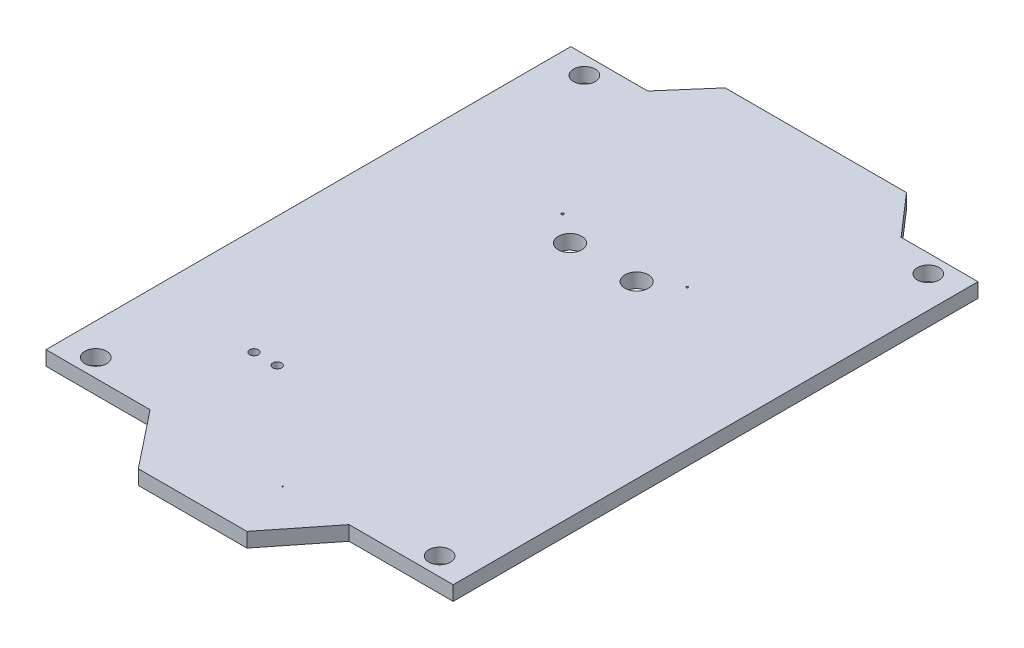
ISO-10303-21;
HEADER;
FILE_DESCRIPTION(('STEP AP214'),'2;1');
FILE_NAME('part.step','',(''),(''),'','','');
FILE_SCHEMA(('AUTOMOTIVE_DESIGN { 1 0 10303 214 1 1 1 1 }'));
ENDSEC;
DATA;
#1=APPLICATION_CONTEXT('core data for automotive mechanical design processes');
#2=APPLICATION_PROTOCOL_DEFINITION('international standard','automotive_design',2000,#1);
#3=PRODUCT_CONTEXT('',#1,'mechanical');
#4=PRODUCT('Part','Part','',(#3));
#5=PRODUCT_RELATED_PRODUCT_CATEGORY('part','',(#4));
#6=PRODUCT_DEFINITION_FORMATION('','',#4);
#7=PRODUCT_DEFINITION_CONTEXT('part definition',#1,'design');
#8=PRODUCT_DEFINITION('design','',#6,#7);
#9=PRODUCT_DEFINITION_SHAPE('','',#8);
#10=(LENGTH_UNIT() NAMED_UNIT(*) SI_UNIT(.MILLI.,.METRE.));
#11=(NAMED_UNIT(*) PLANE_ANGLE_UNIT() SI_UNIT($,.RADIAN.));
#12=(NAMED_UNIT(*) SI_UNIT($,.STERADIAN.) SOLID_ANGLE_UNIT());
#13=UNCERTAINTY_MEASURE_WITH_UNIT(LENGTH_MEASURE(1.E-05),#10,'distance_accuracy_value','');
#14=(GEOMETRIC_REPRESENTATION_CONTEXT(3) GLOBAL_UNCERTAINTY_ASSIGNED_CONTEXT((#13)) GLOBAL_UNIT_ASSIGNED_CONTEXT((#10,
#11,#12)) REPRESENTATION_CONTEXT('',''));
#15=CARTESIAN_POINT('',(0.,0.,0.));
#16=DIRECTION('',(0.,0.,1.));
#17=DIRECTION('',(1.,0.,0.));
#18=AXIS2_PLACEMENT_3D('',#15,#16,#17);
#19=CARTESIAN_POINT('',(-0.0309185608602787,4.07949258906316,0.0488366244301609));
#20=DIRECTION('',(0.,1.,0.));
#21=DIRECTION('',(0.,0.,1.));
#22=AXIS2_PLACEMENT_3D('',#19,#20,#21);
#23=PLANE('',#22);
#24=CARTESIAN_POINT('',(-10.7846583023091,4.07949258906316,17.8089060338347));
#25=DIRECTION('',(0.,-1.,0.));
#26=DIRECTION('',(1.,0.,0.));
#27=AXIS2_PLACEMENT_3D('',#24,#25,#26);
#28=CIRCLE('',#27,0.482599999999997);
#29=CARTESIAN_POINT('',(-10.3020583023091,4.07949258906316,17.8089060338347));
#30=VERTEX_POINT('',#29);
#31=EDGE_CURVE('E286',#30,#30,#28,.T.);
#32=ORIENTED_EDGE('',*,*,#31,.T.);
#33=EDGE_LOOP('',(#32));
#34=FACE_BOUND('',#33,.T.);
#35=CARTESIAN_POINT('',(-8.24481401918051,4.07949258906316,17.780781001229));
#36=DIRECTION('',(0.,-1.,0.));
#37=DIRECTION('',(1.,0.,0.));
#38=AXIS2_PLACEMENT_3D('',#35,#36,#37);
#39=CIRCLE('',#38,0.4826);
#40=CARTESIAN_POINT('',(-7.76221401918051,4.07949258906316,17.780781001229));
#41=VERTEX_POINT('',#40);
#42=EDGE_CURVE('E290',#41,#41,#39,.T.);
#43=ORIENTED_EDGE('',*,*,#42,.T.);
#44=EDGE_LOOP('',(#43));
#45=FACE_BOUND('',#44,.T.);
#46=CARTESIAN_POINT('',(3.63345968758914,4.07949258906316,29.0658349324321));
#47=DIRECTION('',(0.,-1.,0.));
#48=DIRECTION('',(1.,0.,0.));
#49=AXIS2_PLACEMENT_3D('',#46,#47,#48);
#50=CIRCLE('',#49,0.0585206197350784);
#51=CARTESIAN_POINT('',(3.69198030732421,4.07949258906316,29.0658349324321));
#52=VERTEX_POINT('',#51);
#53=EDGE_CURVE('E294',#52,#52,#50,.T.);
#54=ORIENTED_EDGE('',*,*,#53,.T.);
#55=EDGE_LOOP('',(#54));
#56=FACE_BOUND('',#55,.T.);
#57=CARTESIAN_POINT('',(3.59032109320918,4.07949258906316,-10.104860026321));
#58=DIRECTION('',(0.,-1.,0.));
#59=DIRECTION('',(1.,0.,0.));
#60=AXIS2_PLACEMENT_3D('',#57,#58,#59);
#61=CIRCLE('',#60,1.2954);
#62=CARTESIAN_POINT('',(4.88572109320918,4.07949258906316,-10.104860026321));
#63=VERTEX_POINT('',#62);
#64=EDGE_CURVE('E298',#63,#63,#61,.T.);
#65=ORIENTED_EDGE('',*,*,#64,.T.);
#66=EDGE_LOOP('',(#65));
#67=FACE_BOUND('',#66,.T.);
#68=CARTESIAN_POINT('',(-3.77567890679082,4.07949258906316,-10.104860026321));
#69=DIRECTION('',(0.,-1.,0.));
#70=DIRECTION('',(1.,0.,0.));
#71=AXIS2_PLACEMENT_3D('',#68,#69,#70);
#72=CIRCLE('',#71,1.2954);
#73=CARTESIAN_POINT('',(-2.48027890679082,4.07949258906316,-10.104860026321));
#74=VERTEX_POINT('',#73);
#75=EDGE_CURVE('E302',#74,#74,#72,.T.);
#76=ORIENTED_EDGE('',*,*,#75,.T.);
#77=EDGE_LOOP('',(#76));
#78=FACE_BOUND('',#77,.T.);
#79=CARTESIAN_POINT('',(6.92,4.07949258906316,-12.3671993454184));
#80=DIRECTION('',(0.,-1.,0.));
#81=DIRECTION('',(1.,0.,0.));
#82=AXIS2_PLACEMENT_3D('',#79,#80,#81);
#83=CIRCLE('',#82,0.104439641413149);
#84=CARTESIAN_POINT('',(7.02443964141315,4.07949258906316,-12.3671993454184));
#85=VERTEX_POINT('',#84);
#86=EDGE_CURVE('E306',#85,#85,#83,.T.);
#87=ORIENTED_EDGE('',*,*,#86,.T.);
#88=EDGE_LOOP('',(#87));
#89=FACE_BOUND('',#88,.T.);
#90=CARTESIAN_POINT('',(-6.97838052861289,4.07949258906316,-12.4916101744663));
#91=DIRECTION('',(0.,-1.,0.));
#92=DIRECTION('',(1.,0.,0.));
#93=AXIS2_PLACEMENT_3D('',#90,#91,#92);
#94=CIRCLE('',#93,0.134815518988638);
#95=CARTESIAN_POINT('',(-6.84356500962425,4.07949258906316,-12.4916101744663));
#96=VERTEX_POINT('',#95);
#97=EDGE_CURVE('E146',#96,#96,#94,.T.);
#98=ORIENTED_EDGE('',*,*,#97,.T.);
#99=EDGE_LOOP('',(#98));
#100=FACE_BOUND('',#99,.T.);
#101=CARTESIAN_POINT('',(18.9690814391393,4.07949258906316,-26.9511633755698));
#102=DIRECTION('',(0.,1.,0.));
#103=DIRECTION('',(0.,0.,1.));
#104=AXIS2_PLACEMENT_3D('',#101,#102,#103);
#105=CIRCLE('',#104,1.20000000000002);
#106=CARTESIAN_POINT('',(18.9690814391393,4.07949258906316,-25.7511633755698));
#107=VERTEX_POINT('',#106);
#108=EDGE_CURVE('E224',#107,#107,#105,.F.);
#109=ORIENTED_EDGE('',*,*,#108,.T.);
#110=EDGE_LOOP('',(#109));
#111=FACE_BOUND('',#110,.T.);
#112=CARTESIAN_POINT('',(-19.0309185608606,4.07949258906316,27.0488366244302));
#113=DIRECTION('',(0.,1.,0.));
#114=DIRECTION('',(0.,0.,1.));
#115=AXIS2_PLACEMENT_3D('',#112,#113,#114);
#116=CIRCLE('',#115,1.19999999999999);
#117=CARTESIAN_POINT('',(-19.0309185608606,4.07949258906316,28.2488366244302));
#118=VERTEX_POINT('',#117);
#119=EDGE_CURVE('E196',#118,#118,#116,.F.);
#120=ORIENTED_EDGE('',*,*,#119,.T.);
#121=EDGE_LOOP('',(#120));
#122=FACE_BOUND('',#121,.T.);
#123=CARTESIAN_POINT('',(18.9690814391393,4.07949258906316,27.0488366244302));
#124=DIRECTION('',(0.,1.,0.));
#125=DIRECTION('',(0.,0.,1.));
#126=AXIS2_PLACEMENT_3D('',#123,#124,#125);
#127=CIRCLE('',#126,1.20000000000002);
#128=CARTESIAN_POINT('',(18.9690814391393,4.07949258906316,28.2488366244302));
#129=VERTEX_POINT('',#128);
#130=EDGE_CURVE('E215',#129,#129,#127,.F.);
#131=ORIENTED_EDGE('',*,*,#130,.T.);
#132=EDGE_LOOP('',(#131));
#133=FACE_BOUND('',#132,.T.);
#134=CARTESIAN_POINT('',(-19.0309185608606,4.07949258906316,-26.9511633755698));
#135=DIRECTION('',(0.,1.,0.));
#136=DIRECTION('',(0.,0.,1.));
#137=AXIS2_PLACEMENT_3D('',#134,#135,#136);
#138=CIRCLE('',#137,1.20000000000002);
#139=CARTESIAN_POINT('',(-19.0309185608606,4.07949258906316,-25.7511633755698));
#140=VERTEX_POINT('',#139);
#141=EDGE_CURVE('E35',#140,#140,#138,.F.);
#142=ORIENTED_EDGE('',*,*,#141,.T.);
#143=EDGE_LOOP('',(#142));
#144=FACE_BOUND('',#143,.T.);
#145=DIRECTION('',(-0.656178714924787,0.,-0.754605522163505));
#146=VECTOR('',#145,1.);
#147=CARTESIAN_POINT('',(13.9690814391397,4.07949258906316,-28.9511633755698));
#148=LINE('',#147,#146);
#149=CARTESIAN_POINT('',(13.9690814391397,4.07949258906316,-28.9511633755698));
#150=VERTEX_POINT('',#149);
#151=CARTESIAN_POINT('',(9.98761862555359,4.07949258906316,-33.5298456111939));
#152=VERTEX_POINT('',#151);
#153=EDGE_CURVE('E133',#150,#152,#148,.T.);
#154=ORIENTED_EDGE('',*,*,#153,.T.);
#155=DIRECTION('',(1.,0.,0.));
#156=VECTOR('',#155,1.);
#157=CARTESIAN_POINT('',(-10.0494557472741,4.07949258906316,-33.5298456111939));
#158=LINE('',#157,#156);
#159=CARTESIAN_POINT('',(-10.0494557472741,4.07949258906316,-33.5298456111939));
#160=VERTEX_POINT('',#159);
#161=EDGE_CURVE('E120',#160,#152,#158,.T.);
#162=ORIENTED_EDGE('',*,*,#161,.F.);
#163=DIRECTION('',(0.656178714924787,0.,-0.754605522163505));
#164=VECTOR('',#163,1.);
#165=CARTESIAN_POINT('',(-14.0309185608603,4.07949258906316,-28.9511633755698));
#166=LINE('',#165,#164);
#167=CARTESIAN_POINT('',(-14.0309185608603,4.07949258906316,-28.9511633755698));
#168=VERTEX_POINT('',#167);
#169=EDGE_CURVE('E142',#168,#160,#166,.T.);
#170=ORIENTED_EDGE('',*,*,#169,.F.);
#171=DIRECTION('',(-1.,0.,0.));
#172=VECTOR('',#171,1.);
#173=CARTESIAN_POINT('',(-22.5309185608603,4.07949258906316,-28.9511633755698));
#174=LINE('',#173,#172);
#175=CARTESIAN_POINT('',(-22.5309185608603,4.07949258906316,-28.9511633755698));
#176=VERTEX_POINT('',#175);
#177=EDGE_CURVE('E210',#168,#176,#174,.T.);
#178=ORIENTED_EDGE('',*,*,#177,.T.);
#179=DIRECTION('',(0.,0.,1.));
#180=VECTOR('',#179,1.);
#181=CARTESIAN_POINT('',(-22.5309185608603,4.07949258906316,29.0488366244302));
#182=LINE('',#181,#180);
#183=CARTESIAN_POINT('',(-22.5309185608603,4.07949258906316,29.0488366244302));
#184=VERTEX_POINT('',#183);
#185=EDGE_CURVE('E204',#176,#184,#182,.T.);
#186=ORIENTED_EDGE('',*,*,#185,.T.);
#187=DIRECTION('',(1.,0.,0.));
#188=VECTOR('',#187,1.);
#189=CARTESIAN_POINT('',(-22.5309185608603,4.07949258906316,29.0488366244302));
#190=LINE('',#189,#188);
#191=CARTESIAN_POINT('',(-11.0309185608603,4.07949258906316,29.0488366244302));
#192=VERTEX_POINT('',#191);
#193=EDGE_CURVE('E193',#184,#192,#190,.T.);
#194=ORIENTED_EDGE('',*,*,#193,.T.);
#195=DIRECTION('',(0.62165785956401,0.,0.783288903050652));
#196=VECTOR('',#195,1.);
#197=CARTESIAN_POINT('',(-11.0309185608603,4.07949258906316,29.0488366244302));
#198=LINE('',#197,#196);
#199=CARTESIAN_POINT('',(-6.03091856086027,4.07949258906316,35.3488366244302));
#200=VERTEX_POINT('',#199);
#201=EDGE_CURVE('E165',#192,#200,#198,.T.);
#202=ORIENTED_EDGE('',*,*,#201,.T.);
#203=DIRECTION('',(-1.,0.,0.));
#204=VECTOR('',#203,1.);
#205=CARTESIAN_POINT('',(10.9690814391397,4.07949258906316,35.3488366244302));
#206=LINE('',#205,#204);
#207=CARTESIAN_POINT('',(5.96908143913972,4.07949258906316,35.3488366244302));
#208=VERTEX_POINT('',#207);
#209=EDGE_CURVE('E172',#208,#200,#206,.T.);
#210=ORIENTED_EDGE('',*,*,#209,.F.);
#211=DIRECTION('',(-0.62165785956401,0.,0.783288903050652));
#212=VECTOR('',#211,1.);
#213=CARTESIAN_POINT('',(20.8392313850355,4.07949258906316,16.6124476926014));
#214=LINE('',#213,#212);
#215=CARTESIAN_POINT('',(10.9690814391397,4.07949258906316,29.0488366244302));
#216=VERTEX_POINT('',#215);
#217=EDGE_CURVE('E56',#216,#208,#214,.T.);
#218=ORIENTED_EDGE('',*,*,#217,.F.);
#219=CARTESIAN_POINT('',(22.4690814391397,4.07949258906316,29.0488366244302));
#220=VERTEX_POINT('',#219);
#221=EDGE_CURVE('E197',#216,#220,#190,.T.);
#222=ORIENTED_EDGE('',*,*,#221,.T.);
#223=DIRECTION('',(0.,0.,-1.));
#224=VECTOR('',#223,1.);
#225=CARTESIAN_POINT('',(22.4690814391397,4.07949258906316,29.0488366244302));
#226=LINE('',#225,#224);
#227=CARTESIAN_POINT('',(22.4690814391397,4.07949258906316,-28.9511633755698));
#228=VERTEX_POINT('',#227);
#229=EDGE_CURVE('E214',#220,#228,#226,.T.);
#230=ORIENTED_EDGE('',*,*,#229,.T.);
#231=EDGE_CURVE('E141',#228,#150,#174,.T.);
#232=ORIENTED_EDGE('',*,*,#231,.T.);
#233=EDGE_LOOP('',(#154,#162,#170,#178,#186,#194,#202,#210,#218,#222,#230,#232));
#234=FACE_BOUND('',#233,.T.);
#235=ADVANCED_FACE('F32',(#34,#45,#56,#67,#78,#89,#100,#111,#122,#133,#144,#234),#23,.T.);
#236=CARTESIAN_POINT('',(-0.0309185608602789,2.47949258906316,0.0488366244301609));
#237=DIRECTION('',(0.,1.,0.));
#238=DIRECTION('',(0.,0.,1.));
#239=AXIS2_PLACEMENT_3D('',#236,#237,#238);
#240=PLANE('',#239);
#241=CARTESIAN_POINT('',(-19.0309185608606,2.47949258906316,-26.9511633755698));
#242=DIRECTION('',(0.,1.,0.));
#243=DIRECTION('',(0.,0.,1.));
#244=AXIS2_PLACEMENT_3D('',#241,#242,#243);
#245=CIRCLE('',#244,1.20000000000002);
#246=CARTESIAN_POINT('',(-19.0309185608606,2.47949258906316,-25.7511633755698));
#247=VERTEX_POINT('',#246);
#248=EDGE_CURVE('E221',#247,#247,#245,.F.);
#249=ORIENTED_EDGE('',*,*,#248,.F.);
#250=EDGE_LOOP('',(#249));
#251=FACE_BOUND('',#250,.T.);
#252=CARTESIAN_POINT('',(18.9690814391393,2.47949258906316,27.0488366244302));
#253=DIRECTION('',(0.,1.,0.));
#254=DIRECTION('',(0.,0.,1.));
#255=AXIS2_PLACEMENT_3D('',#252,#253,#254);
#256=CIRCLE('',#255,1.20000000000002);
#257=CARTESIAN_POINT('',(18.9690814391393,2.47949258906316,28.2488366244302));
#258=VERTEX_POINT('',#257);
#259=EDGE_CURVE('E192',#258,#258,#256,.F.);
#260=ORIENTED_EDGE('',*,*,#259,.F.);
#261=EDGE_LOOP('',(#260));
#262=FACE_BOUND('',#261,.T.);
#263=CARTESIAN_POINT('',(-19.0309185608606,2.47949258906316,27.0488366244302));
#264=DIRECTION('',(0.,1.,0.));
#265=DIRECTION('',(0.,0.,1.));
#266=AXIS2_PLACEMENT_3D('',#263,#264,#265);
#267=CIRCLE('',#266,1.19999999999999);
#268=CARTESIAN_POINT('',(-19.0309185608606,2.47949258906316,28.2488366244302));
#269=VERTEX_POINT('',#268);
#270=EDGE_CURVE('E40',#269,#269,#267,.F.);
#271=ORIENTED_EDGE('',*,*,#270,.F.);
#272=EDGE_LOOP('',(#271));
#273=FACE_BOUND('',#272,.T.);
#274=CARTESIAN_POINT('',(18.9690814391393,2.47949258906316,-26.9511633755698));
#275=DIRECTION('',(0.,1.,0.));
#276=DIRECTION('',(0.,0.,1.));
#277=AXIS2_PLACEMENT_3D('',#274,#275,#276);
#278=CIRCLE('',#277,1.20000000000002);
#279=CARTESIAN_POINT('',(18.9690814391393,2.47949258906316,-25.7511633755698));
#280=VERTEX_POINT('',#279);
#281=EDGE_CURVE('E11',#280,#280,#278,.F.);
#282=ORIENTED_EDGE('',*,*,#281,.F.);
#283=EDGE_LOOP('',(#282));
#284=FACE_BOUND('',#283,.T.);
#285=CARTESIAN_POINT('',(-6.97838052861289,2.47949258906316,-12.4916101744663));
#286=DIRECTION('',(0.,-1.,0.));
#287=DIRECTION('',(1.,0.,0.));
#288=AXIS2_PLACEMENT_3D('',#285,#286,#287);
#289=CIRCLE('',#288,0.134815518988638);
#290=CARTESIAN_POINT('',(-6.84356500962425,2.47949258906316,-12.4916101744663));
#291=VERTEX_POINT('',#290);
#292=EDGE_CURVE('E256',#291,#291,#289,.T.);
#293=ORIENTED_EDGE('',*,*,#292,.F.);
#294=EDGE_LOOP('',(#293));
#295=FACE_BOUND('',#294,.T.);
#296=CARTESIAN_POINT('',(6.92,2.47949258906316,-12.3671993454184));
#297=DIRECTION('',(0.,-1.,0.));
#298=DIRECTION('',(1.,0.,0.));
#299=AXIS2_PLACEMENT_3D('',#296,#297,#298);
#300=CIRCLE('',#299,0.104439641413149);
#301=CARTESIAN_POINT('',(7.02443964141315,2.47949258906316,-12.3671993454184));
#302=VERTEX_POINT('',#301);
#303=EDGE_CURVE('E260',#302,#302,#300,.T.);
#304=ORIENTED_EDGE('',*,*,#303,.F.);
#305=EDGE_LOOP('',(#304));
#306=FACE_BOUND('',#305,.T.);
#307=CARTESIAN_POINT('',(-3.77567890679082,2.47949258906316,-10.104860026321));
#308=DIRECTION('',(0.,-1.,0.));
#309=DIRECTION('',(1.,0.,0.));
#310=AXIS2_PLACEMENT_3D('',#307,#308,#309);
#311=CIRCLE('',#310,1.2954);
#312=CARTESIAN_POINT('',(-2.48027890679082,2.47949258906316,-10.104860026321));
#313=VERTEX_POINT('',#312);
#314=EDGE_CURVE('E264',#313,#313,#311,.T.);
#315=ORIENTED_EDGE('',*,*,#314,.F.);
#316=EDGE_LOOP('',(#315));
#317=FACE_BOUND('',#316,.T.);
#318=CARTESIAN_POINT('',(3.59032109320918,2.47949258906316,-10.104860026321));
#319=DIRECTION('',(0.,-1.,0.));
#320=DIRECTION('',(1.,0.,0.));
#321=AXIS2_PLACEMENT_3D('',#318,#319,#320);
#322=CIRCLE('',#321,1.2954);
#323=CARTESIAN_POINT('',(4.88572109320918,2.47949258906316,-10.104860026321));
#324=VERTEX_POINT('',#323);
#325=EDGE_CURVE('E268',#324,#324,#322,.T.);
#326=ORIENTED_EDGE('',*,*,#325,.F.);
#327=EDGE_LOOP('',(#326));
#328=FACE_BOUND('',#327,.T.);
#329=CARTESIAN_POINT('',(3.63345968758914,2.47949258906316,29.0658349324321));
#330=DIRECTION('',(0.,-1.,0.));
#331=DIRECTION('',(1.,0.,0.));
#332=AXIS2_PLACEMENT_3D('',#329,#330,#331);
#333=CIRCLE('',#332,0.0585206197350784);
#334=CARTESIAN_POINT('',(3.69198030732421,2.47949258906316,29.0658349324321));
#335=VERTEX_POINT('',#334);
#336=EDGE_CURVE('E272',#335,#335,#333,.T.);
#337=ORIENTED_EDGE('',*,*,#336,.F.);
#338=EDGE_LOOP('',(#337));
#339=FACE_BOUND('',#338,.T.);
#340=CARTESIAN_POINT('',(-8.24481401918051,2.47949258906316,17.780781001229));
#341=DIRECTION('',(0.,-1.,0.));
#342=DIRECTION('',(1.,0.,0.));
#343=AXIS2_PLACEMENT_3D('',#340,#341,#342);
#344=CIRCLE('',#343,0.4826);
#345=CARTESIAN_POINT('',(-7.76221401918051,2.47949258906316,17.780781001229));
#346=VERTEX_POINT('',#345);
#347=EDGE_CURVE('E276',#346,#346,#344,.T.);
#348=ORIENTED_EDGE('',*,*,#347,.F.);
#349=EDGE_LOOP('',(#348));
#350=FACE_BOUND('',#349,.T.);
#351=CARTESIAN_POINT('',(-10.7846583023091,2.47949258906316,17.8089060338347));
#352=DIRECTION('',(0.,-1.,0.));
#353=DIRECTION('',(1.,0.,0.));
#354=AXIS2_PLACEMENT_3D('',#351,#352,#353);
#355=CIRCLE('',#354,0.482599999999997);
#356=CARTESIAN_POINT('',(-10.3020583023091,2.47949258906316,17.8089060338347));
#357=VERTEX_POINT('',#356);
#358=EDGE_CURVE('E137',#357,#357,#355,.T.);
#359=ORIENTED_EDGE('',*,*,#358,.F.);
#360=EDGE_LOOP('',(#359));
#361=FACE_BOUND('',#360,.T.);
#362=DIRECTION('',(1.,0.,0.));
#363=VECTOR('',#362,1.);
#364=CARTESIAN_POINT('',(-10.0494557472741,2.47949258906316,-33.5298456111939));
#365=LINE('',#364,#363);
#366=CARTESIAN_POINT('',(-10.0494557472742,2.47949258906316,-33.5298456111939));
#367=VERTEX_POINT('',#366);
#368=CARTESIAN_POINT('',(9.98761862555359,2.47949258906316,-33.5298456111939));
#369=VERTEX_POINT('',#368);
#370=EDGE_CURVE('E48',#367,#369,#365,.T.);
#371=ORIENTED_EDGE('',*,*,#370,.T.);
#372=DIRECTION('',(-0.656178714924787,0.,-0.754605522163505));
#373=VECTOR('',#372,1.);
#374=CARTESIAN_POINT('',(13.9690814391397,2.47949258906316,-28.9511633755698));
#375=LINE('',#374,#373);
#376=CARTESIAN_POINT('',(13.9690814391397,2.47949258906316,-28.9511633755698));
#377=VERTEX_POINT('',#376);
#378=EDGE_CURVE('E136',#377,#369,#375,.T.);
#379=ORIENTED_EDGE('',*,*,#378,.F.);
#380=DIRECTION('',(1.,0.,0.));
#381=VECTOR('',#380,1.);
#382=CARTESIAN_POINT('',(-0.0309185608602789,2.47949258906316,-28.9511633755698));
#383=LINE('',#382,#381);
#384=CARTESIAN_POINT('',(22.4690814391397,2.47949258906316,-28.9511633755698));
#385=VERTEX_POINT('',#384);
#386=EDGE_CURVE('E185',#385,#377,#383,.F.);
#387=ORIENTED_EDGE('',*,*,#386,.F.);
#388=DIRECTION('',(0.,0.,1.));
#389=VECTOR('',#388,1.);
#390=CARTESIAN_POINT('',(22.4690814391397,2.47949258906316,0.0488366244301609));
#391=LINE('',#390,#389);
#392=CARTESIAN_POINT('',(22.4690814391397,2.47949258906316,29.0488366244302));
#393=VERTEX_POINT('',#392);
#394=EDGE_CURVE('E189',#393,#385,#391,.F.);
#395=ORIENTED_EDGE('',*,*,#394,.F.);
#396=DIRECTION('',(1.,0.,0.));
#397=VECTOR('',#396,1.);
#398=CARTESIAN_POINT('',(-0.0309185608602789,2.47949258906316,29.0488366244302));
#399=LINE('',#398,#397);
#400=CARTESIAN_POINT('',(10.9690814391397,2.47949258906316,29.0488366244302));
#401=VERTEX_POINT('',#400);
#402=EDGE_CURVE('E181',#401,#393,#399,.T.);
#403=ORIENTED_EDGE('',*,*,#402,.F.);
#404=DIRECTION('',(-0.62165785956401,0.,0.783288903050652));
#405=VECTOR('',#404,1.);
#406=CARTESIAN_POINT('',(20.8392313850355,2.47949258906316,16.6124476926014));
#407=LINE('',#406,#405);
#408=CARTESIAN_POINT('',(5.96908143913972,2.47949258906316,35.3488366244302));
#409=VERTEX_POINT('',#408);
#410=EDGE_CURVE('E157',#401,#409,#407,.T.);
#411=ORIENTED_EDGE('',*,*,#410,.T.);
#412=DIRECTION('',(1.,0.,0.));
#413=VECTOR('',#412,1.);
#414=CARTESIAN_POINT('',(10.9690814391397,2.47949258906316,35.3488366244302));
#415=LINE('',#414,#413);
#416=CARTESIAN_POINT('',(-6.03091856086027,2.47949258906316,35.3488366244302));
#417=VERTEX_POINT('',#416);
#418=EDGE_CURVE('E169',#417,#409,#415,.T.);
#419=ORIENTED_EDGE('',*,*,#418,.F.);
#420=DIRECTION('',(0.62165785956401,0.,0.783288903050652));
#421=VECTOR('',#420,1.);
#422=CARTESIAN_POINT('',(-11.0309185608603,2.47949258906316,29.0488366244302));
#423=LINE('',#422,#421);
#424=CARTESIAN_POINT('',(-11.0309185608603,2.47949258906316,29.0488366244302));
#425=VERTEX_POINT('',#424);
#426=EDGE_CURVE('E160',#425,#417,#423,.T.);
#427=ORIENTED_EDGE('',*,*,#426,.F.);
#428=CARTESIAN_POINT('',(-22.5309185608603,2.47949258906316,29.0488366244302));
#429=VERTEX_POINT('',#428);
#430=EDGE_CURVE('E178',#429,#425,#399,.T.);
#431=ORIENTED_EDGE('',*,*,#430,.F.);
#432=DIRECTION('',(0.,0.,1.));
#433=VECTOR('',#432,1.);
#434=CARTESIAN_POINT('',(-22.5309185608603,2.47949258906316,0.0488366244301609));
#435=LINE('',#434,#433);
#436=CARTESIAN_POINT('',(-22.5309185608603,2.47949258906316,-28.9511633755698));
#437=VERTEX_POINT('',#436);
#438=EDGE_CURVE('E182',#437,#429,#435,.T.);
#439=ORIENTED_EDGE('',*,*,#438,.F.);
#440=CARTESIAN_POINT('',(-14.0309185608603,2.47949258906316,-28.9511633755698));
#441=VERTEX_POINT('',#440);
#442=EDGE_CURVE('E188',#441,#437,#383,.F.);
#443=ORIENTED_EDGE('',*,*,#442,.F.);
#444=DIRECTION('',(0.656178714924787,0.,-0.754605522163505));
#445=VECTOR('',#444,1.);
#446=CARTESIAN_POINT('',(-14.0309185608603,2.47949258906316,-28.9511633755698));
#447=LINE('',#446,#445);
#448=EDGE_CURVE('E144',#441,#367,#447,.T.);
#449=ORIENTED_EDGE('',*,*,#448,.T.);
#450=EDGE_LOOP('',(#371,#379,#387,#395,#403,#411,#419,#427,#431,#439,#443,#449));
#451=FACE_BOUND('',#450,.T.);
#452=ADVANCED_FACE('F243',(#251,#262,#273,#284,#295,#306,#317,#328,#339,#350,#361,#451),#240,.F.);
#453=CARTESIAN_POINT('',(13.9690814391397,2.47949258906316,-28.9511633755698));
#454=DIRECTION('',(0.754605522163505,0.,-0.656178714924787));
#455=DIRECTION('',(0.656178714924787,0.,0.754605522163505));
#456=AXIS2_PLACEMENT_3D('',#453,#454,#455);
#457=PLANE('',#456);
#458=ORIENTED_EDGE('',*,*,#378,.T.);
#459=DIRECTION('',(0.,-1.,0.));
#460=VECTOR('',#459,1.);
#461=CARTESIAN_POINT('',(9.98761862555359,4.07949258906316,-33.5298456111939));
#462=LINE('',#461,#460);
#463=EDGE_CURVE('E123',#152,#369,#462,.T.);
#464=ORIENTED_EDGE('',*,*,#463,.F.);
#465=ORIENTED_EDGE('',*,*,#153,.F.);
#466=DIRECTION('',(0.,-1.,0.));
#467=VECTOR('',#466,1.);
#468=CARTESIAN_POINT('',(13.9690814391397,2.47949258906316,-28.9511633755698));
#469=LINE('',#468,#467);
#470=EDGE_CURVE('E150',#150,#377,#469,.T.);
#471=ORIENTED_EDGE('',*,*,#470,.T.);
#472=EDGE_LOOP('',(#458,#464,#465,#471));
#473=FACE_BOUND('',#472,.T.);
#474=ADVANCED_FACE('F132',(#473),#457,.T.);
#475=CARTESIAN_POINT('',(-14.0309185608603,2.47949258906316,-28.9511633755698));
#476=DIRECTION('',(0.754605522163505,0.,0.656178714924787));
#477=DIRECTION('',(-0.656178714924787,0.,0.754605522163505));
#478=AXIS2_PLACEMENT_3D('',#475,#476,#477);
#479=PLANE('',#478);
#480=DIRECTION('',(0.,-1.,0.));
#481=VECTOR('',#480,1.);
#482=CARTESIAN_POINT('',(-10.0494557472741,4.07949258906316,-33.5298456111939));
#483=LINE('',#482,#481);
#484=EDGE_CURVE('E124',#160,#367,#483,.T.);
#485=ORIENTED_EDGE('',*,*,#484,.T.);
#486=ORIENTED_EDGE('',*,*,#448,.F.);
#487=DIRECTION('',(0.,1.,0.));
#488=VECTOR('',#487,1.);
#489=CARTESIAN_POINT('',(-14.0309185608603,2.47949258906316,-28.9511633755698));
#490=LINE('',#489,#488);
#491=EDGE_CURVE('E152',#441,#168,#490,.T.);
#492=ORIENTED_EDGE('',*,*,#491,.T.);
#493=ORIENTED_EDGE('',*,*,#169,.T.);
#494=EDGE_LOOP('',(#485,#486,#492,#493));
#495=FACE_BOUND('',#494,.T.);
#496=ADVANCED_FACE('F378',(#495),#479,.F.);
#497=CARTESIAN_POINT('',(-22.5309185608603,2.47949258906316,-28.9511633755698));
#498=DIRECTION('',(0.,0.,1.));
#499=DIRECTION('',(-1.,0.,0.));
#500=AXIS2_PLACEMENT_3D('',#497,#498,#499);
#501=PLANE('',#500);
#502=ORIENTED_EDGE('',*,*,#470,.F.);
#503=ORIENTED_EDGE('',*,*,#231,.F.);
#504=DIRECTION('',(0.,-1.,0.));
#505=VECTOR('',#504,1.);
#506=CARTESIAN_POINT('',(22.4690814391397,2.47949258906316,-28.9511633755698));
#507=LINE('',#506,#505);
#508=EDGE_CURVE('E211',#385,#228,#507,.F.);
#509=ORIENTED_EDGE('',*,*,#508,.F.);
#510=ORIENTED_EDGE('',*,*,#386,.T.);
#511=EDGE_LOOP('',(#502,#503,#509,#510));
#512=FACE_BOUND('',#511,.T.);
#513=ADVANCED_FACE('F374',(#512),#501,.F.);
#514=ORIENTED_EDGE('',*,*,#491,.F.);
#515=ORIENTED_EDGE('',*,*,#442,.T.);
#516=DIRECTION('',(0.,-1.,0.));
#517=VECTOR('',#516,1.);
#518=CARTESIAN_POINT('',(-22.5309185608603,2.47949258906316,-28.9511633755698));
#519=LINE('',#518,#517);
#520=EDGE_CURVE('E206',#437,#176,#519,.F.);
#521=ORIENTED_EDGE('',*,*,#520,.T.);
#522=ORIENTED_EDGE('',*,*,#177,.F.);
#523=EDGE_LOOP('',(#514,#515,#521,#522));
#524=FACE_BOUND('',#523,.T.);
#525=ADVANCED_FACE('F377',(#524),#501,.F.);
#526=CARTESIAN_POINT('',(-0.0309185608602787,4.07949258906316,35.3488366244302));
#527=DIRECTION('',(0.,0.,1.));
#528=DIRECTION('',(-1.,0.,0.));
#529=AXIS2_PLACEMENT_3D('',#526,#527,#528);
#530=PLANE('',#529);
#531=ORIENTED_EDGE('',*,*,#418,.T.);
#532=DIRECTION('',(0.,-1.,0.));
#533=VECTOR('',#532,1.);
#534=CARTESIAN_POINT('',(5.96908143913972,4.07949258906316,35.3488366244302));
#535=LINE('',#534,#533);
#536=EDGE_CURVE('E156',#208,#409,#535,.T.);
#537=ORIENTED_EDGE('',*,*,#536,.F.);
#538=ORIENTED_EDGE('',*,*,#209,.T.);
#539=DIRECTION('',(0.,-1.,0.));
#540=VECTOR('',#539,1.);
#541=CARTESIAN_POINT('',(-6.03091856086027,4.07949258906316,35.3488366244302));
#542=LINE('',#541,#540);
#543=EDGE_CURVE('E154',#200,#417,#542,.T.);
#544=ORIENTED_EDGE('',*,*,#543,.T.);
#545=EDGE_LOOP('',(#531,#537,#538,#544));
#546=FACE_BOUND('',#545,.T.);
#547=ADVANCED_FACE('F371',(#546),#530,.T.);
#548=CARTESIAN_POINT('',(-22.5309185608603,2.47949258906316,29.0488366244302));
#549=DIRECTION('',(0.,0.,-1.));
#550=DIRECTION('',(1.,0.,0.));
#551=AXIS2_PLACEMENT_3D('',#548,#549,#550);
#552=PLANE('',#551);
#553=DIRECTION('',(0.,-1.,0.));
#554=VECTOR('',#553,1.);
#555=CARTESIAN_POINT('',(-11.0309185608603,2.47949258906316,29.0488366244302));
#556=LINE('',#555,#554);
#557=EDGE_CURVE('E162',#192,#425,#556,.T.);
#558=ORIENTED_EDGE('',*,*,#557,.F.);
#559=ORIENTED_EDGE('',*,*,#193,.F.);
#560=DIRECTION('',(0.,-1.,0.));
#561=VECTOR('',#560,1.);
#562=CARTESIAN_POINT('',(-22.5309185608603,2.47949258906316,29.0488366244302));
#563=LINE('',#562,#561);
#564=EDGE_CURVE('E198',#429,#184,#563,.F.);
#565=ORIENTED_EDGE('',*,*,#564,.F.);
#566=ORIENTED_EDGE('',*,*,#430,.T.);
#567=EDGE_LOOP('',(#558,#559,#565,#566));
#568=FACE_BOUND('',#567,.T.);
#569=ADVANCED_FACE('F369',(#568),#552,.F.);
#570=DIRECTION('',(0.,1.,0.));
#571=VECTOR('',#570,1.);
#572=CARTESIAN_POINT('',(10.9690814391397,2.47949258906316,29.0488366244302));
#573=LINE('',#572,#571);
#574=EDGE_CURVE('E173',#401,#216,#573,.T.);
#575=ORIENTED_EDGE('',*,*,#574,.F.);
#576=ORIENTED_EDGE('',*,*,#402,.T.);
#577=DIRECTION('',(0.,-1.,0.));
#578=VECTOR('',#577,1.);
#579=CARTESIAN_POINT('',(22.4690814391397,2.47949258906316,29.0488366244302));
#580=LINE('',#579,#578);
#581=EDGE_CURVE('E201',#220,#393,#580,.T.);
#582=ORIENTED_EDGE('',*,*,#581,.F.);
#583=ORIENTED_EDGE('',*,*,#221,.F.);
#584=EDGE_LOOP('',(#575,#576,#582,#583));
#585=FACE_BOUND('',#584,.T.);
#586=ADVANCED_FACE('F239',(#585),#552,.F.);
#587=CARTESIAN_POINT('',(-19.0309185608606,2.47949258906316,-26.9511633755698));
#588=DIRECTION('',(0.,1.,0.));
#589=DIRECTION('',(0.,0.,1.));
#590=AXIS2_PLACEMENT_3D('',#587,#588,#589);
#591=CYLINDRICAL_SURFACE('',#590,1.20000000000002);
#592=ORIENTED_EDGE('',*,*,#141,.F.);
#593=EDGE_LOOP('',(#592));
#594=FACE_BOUND('',#593,.T.);
#595=ORIENTED_EDGE('',*,*,#248,.T.);
#596=EDGE_LOOP('',(#595));
#597=FACE_BOUND('',#596,.T.);
#598=ADVANCED_FACE('F235',(#594,#597),#591,.F.);
#599=CARTESIAN_POINT('',(18.9690814391393,2.47949258906316,27.0488366244302));
#600=DIRECTION('',(0.,1.,0.));
#601=DIRECTION('',(0.,0.,1.));
#602=AXIS2_PLACEMENT_3D('',#599,#600,#601);
#603=CYLINDRICAL_SURFACE('',#602,1.20000000000002);
#604=ORIENTED_EDGE('',*,*,#130,.F.);
#605=EDGE_LOOP('',(#604));
#606=FACE_BOUND('',#605,.T.);
#607=ORIENTED_EDGE('',*,*,#259,.T.);
#608=EDGE_LOOP('',(#607));
#609=FACE_BOUND('',#608,.T.);
#610=ADVANCED_FACE('F238',(#606,#609),#603,.F.);
#611=CARTESIAN_POINT('',(22.4690814391397,2.47949258906316,29.0488366244302));
#612=DIRECTION('',(-1.,0.,0.));
#613=DIRECTION('',(0.,0.,-1.));
#614=AXIS2_PLACEMENT_3D('',#611,#612,#613);
#615=PLANE('',#614);
#616=ORIENTED_EDGE('',*,*,#581,.T.);
#617=ORIENTED_EDGE('',*,*,#394,.T.);
#618=ORIENTED_EDGE('',*,*,#508,.T.);
#619=ORIENTED_EDGE('',*,*,#229,.F.);
#620=EDGE_LOOP('',(#616,#617,#618,#619));
#621=FACE_BOUND('',#620,.T.);
#622=ADVANCED_FACE('F365',(#621),#615,.F.);
#623=CARTESIAN_POINT('',(-22.5309185608603,2.47949258906316,29.0488366244302));
#624=DIRECTION('',(1.,0.,0.));
#625=DIRECTION('',(0.,0.,1.));
#626=AXIS2_PLACEMENT_3D('',#623,#624,#625);
#627=PLANE('',#626);
#628=ORIENTED_EDGE('',*,*,#520,.F.);
#629=ORIENTED_EDGE('',*,*,#438,.T.);
#630=ORIENTED_EDGE('',*,*,#564,.T.);
#631=ORIENTED_EDGE('',*,*,#185,.F.);
#632=EDGE_LOOP('',(#628,#629,#630,#631));
#633=FACE_BOUND('',#632,.T.);
#634=ADVANCED_FACE('F356',(#633),#627,.F.);
#635=CARTESIAN_POINT('',(-19.0309185608606,2.47949258906316,27.0488366244302));
#636=DIRECTION('',(0.,1.,0.));
#637=DIRECTION('',(0.,0.,1.));
#638=AXIS2_PLACEMENT_3D('',#635,#636,#637);
#639=CYLINDRICAL_SURFACE('',#638,1.19999999999999);
#640=ORIENTED_EDGE('',*,*,#119,.F.);
#641=EDGE_LOOP('',(#640));
#642=FACE_BOUND('',#641,.T.);
#643=ORIENTED_EDGE('',*,*,#270,.T.);
#644=EDGE_LOOP('',(#643));
#645=FACE_BOUND('',#644,.T.);
#646=ADVANCED_FACE('F352',(#642,#645),#639,.F.);
#647=CARTESIAN_POINT('',(18.9690814391393,2.47949258906316,-26.9511633755698));
#648=DIRECTION('',(0.,1.,0.));
#649=DIRECTION('',(0.,0.,1.));
#650=AXIS2_PLACEMENT_3D('',#647,#648,#649);
#651=CYLINDRICAL_SURFACE('',#650,1.20000000000002);
#652=ORIENTED_EDGE('',*,*,#108,.F.);
#653=EDGE_LOOP('',(#652));
#654=FACE_BOUND('',#653,.T.);
#655=ORIENTED_EDGE('',*,*,#281,.T.);
#656=EDGE_LOOP('',(#655));
#657=FACE_BOUND('',#656,.T.);
#658=ADVANCED_FACE('F355',(#654,#657),#651,.F.);
#659=CARTESIAN_POINT('',(-11.0309185608603,4.07949258906316,29.0488366244302));
#660=DIRECTION('',(0.783288903050652,0.,-0.62165785956401));
#661=DIRECTION('',(0.62165785956401,0.,0.783288903050652));
#662=AXIS2_PLACEMENT_3D('',#659,#660,#661);
#663=PLANE('',#662);
#664=ORIENTED_EDGE('',*,*,#426,.T.);
#665=ORIENTED_EDGE('',*,*,#543,.F.);
#666=ORIENTED_EDGE('',*,*,#201,.F.);
#667=ORIENTED_EDGE('',*,*,#557,.T.);
#668=EDGE_LOOP('',(#664,#665,#666,#667));
#669=FACE_BOUND('',#668,.T.);
#670=ADVANCED_FACE('F240',(#669),#663,.F.);
#671=CARTESIAN_POINT('',(20.8392313850355,4.07949258906316,16.6124476926014));
#672=DIRECTION('',(0.783288903050652,0.,0.62165785956401));
#673=DIRECTION('',(-0.62165785956401,0.,0.783288903050652));
#674=AXIS2_PLACEMENT_3D('',#671,#672,#673);
#675=PLANE('',#674);
#676=ORIENTED_EDGE('',*,*,#410,.F.);
#677=ORIENTED_EDGE('',*,*,#574,.T.);
#678=ORIENTED_EDGE('',*,*,#217,.T.);
#679=ORIENTED_EDGE('',*,*,#536,.T.);
#680=EDGE_LOOP('',(#676,#677,#678,#679));
#681=FACE_BOUND('',#680,.T.);
#682=ADVANCED_FACE('F316',(#681),#675,.T.);
#683=CARTESIAN_POINT('',(-6.97838052861289,4.07949258906316,-12.4916101744663));
#684=DIRECTION('',(0.,-1.,0.));
#685=DIRECTION('',(1.,0.,0.));
#686=AXIS2_PLACEMENT_3D('',#683,#684,#685);
#687=CYLINDRICAL_SURFACE('',#686,0.134815518988638);
#688=ORIENTED_EDGE('',*,*,#97,.F.);
#689=EDGE_LOOP('',(#688));
#690=FACE_BOUND('',#689,.T.);
#691=ORIENTED_EDGE('',*,*,#292,.T.);
#692=EDGE_LOOP('',(#691));
#693=FACE_BOUND('',#692,.T.);
#694=ADVANCED_FACE('F313',(#690,#693),#687,.F.);
#695=CARTESIAN_POINT('',(6.92,4.07949258906316,-12.3671993454184));
#696=DIRECTION('',(0.,-1.,0.));
#697=DIRECTION('',(1.,0.,0.));
#698=AXIS2_PLACEMENT_3D('',#695,#696,#697);
#699=CYLINDRICAL_SURFACE('',#698,0.104439641413149);
#700=ORIENTED_EDGE('',*,*,#86,.F.);
#701=EDGE_LOOP('',(#700));
#702=FACE_BOUND('',#701,.T.);
#703=ORIENTED_EDGE('',*,*,#303,.T.);
#704=EDGE_LOOP('',(#703));
#705=FACE_BOUND('',#704,.T.);
#706=ADVANCED_FACE('F315',(#702,#705),#699,.F.);
#707=CARTESIAN_POINT('',(-3.77567890679082,4.07949258906316,-10.104860026321));
#708=DIRECTION('',(0.,-1.,0.));
#709=DIRECTION('',(1.,0.,0.));
#710=AXIS2_PLACEMENT_3D('',#707,#708,#709);
#711=CYLINDRICAL_SURFACE('',#710,1.2954);
#712=ORIENTED_EDGE('',*,*,#75,.F.);
#713=EDGE_LOOP('',(#712));
#714=FACE_BOUND('',#713,.T.);
#715=ORIENTED_EDGE('',*,*,#314,.T.);
#716=EDGE_LOOP('',(#715));
#717=FACE_BOUND('',#716,.T.);
#718=ADVANCED_FACE('F324',(#714,#717),#711,.F.);
#719=CARTESIAN_POINT('',(3.59032109320918,4.07949258906316,-10.104860026321));
#720=DIRECTION('',(0.,-1.,0.));
#721=DIRECTION('',(1.,0.,0.));
#722=AXIS2_PLACEMENT_3D('',#719,#720,#721);
#723=CYLINDRICAL_SURFACE('',#722,1.2954);
#724=ORIENTED_EDGE('',*,*,#64,.F.);
#725=EDGE_LOOP('',(#724));
#726=FACE_BOUND('',#725,.T.);
#727=ORIENTED_EDGE('',*,*,#325,.T.);
#728=EDGE_LOOP('',(#727));
#729=FACE_BOUND('',#728,.T.);
#730=ADVANCED_FACE('F475',(#726,#729),#723,.F.);
#731=CARTESIAN_POINT('',(3.63345968758914,4.07949258906316,29.0658349324321));
#732=DIRECTION('',(0.,-1.,0.));
#733=DIRECTION('',(1.,0.,0.));
#734=AXIS2_PLACEMENT_3D('',#731,#732,#733);
#735=CYLINDRICAL_SURFACE('',#734,0.0585206197350784);
#736=ORIENTED_EDGE('',*,*,#53,.F.);
#737=EDGE_LOOP('',(#736));
#738=FACE_BOUND('',#737,.T.);
#739=ORIENTED_EDGE('',*,*,#336,.T.);
#740=EDGE_LOOP('',(#739));
#741=FACE_BOUND('',#740,.T.);
#742=ADVANCED_FACE('F485',(#738,#741),#735,.F.);
#743=CARTESIAN_POINT('',(-8.24481401918051,4.07949258906316,17.780781001229));
#744=DIRECTION('',(0.,-1.,0.));
#745=DIRECTION('',(1.,0.,0.));
#746=AXIS2_PLACEMENT_3D('',#743,#744,#745);
#747=CYLINDRICAL_SURFACE('',#746,0.4826);
#748=ORIENTED_EDGE('',*,*,#42,.F.);
#749=EDGE_LOOP('',(#748));
#750=FACE_BOUND('',#749,.T.);
#751=ORIENTED_EDGE('',*,*,#347,.T.);
#752=EDGE_LOOP('',(#751));
#753=FACE_BOUND('',#752,.T.);
#754=ADVANCED_FACE('F494',(#750,#753),#747,.F.);
#755=CARTESIAN_POINT('',(-10.7846583023091,4.07949258906316,17.8089060338347));
#756=DIRECTION('',(0.,-1.,0.));
#757=DIRECTION('',(1.,0.,0.));
#758=AXIS2_PLACEMENT_3D('',#755,#756,#757);
#759=CYLINDRICAL_SURFACE('',#758,0.482599999999997);
#760=ORIENTED_EDGE('',*,*,#31,.F.);
#761=EDGE_LOOP('',(#760));
#762=FACE_BOUND('',#761,.T.);
#763=ORIENTED_EDGE('',*,*,#358,.T.);
#764=EDGE_LOOP('',(#763));
#765=FACE_BOUND('',#764,.T.);
#766=ADVANCED_FACE('F503',(#762,#765),#759,.F.);
#767=CARTESIAN_POINT('',(-10.0494557472741,4.07949258906316,-33.5298456111939));
#768=DIRECTION('',(0.,0.,-1.));
#769=DIRECTION('',(0.,1.,0.));
#770=AXIS2_PLACEMENT_3D('',#767,#768,#769);
#771=PLANE('',#770);
#772=ORIENTED_EDGE('',*,*,#370,.F.);
#773=ORIENTED_EDGE('',*,*,#484,.F.);
#774=ORIENTED_EDGE('',*,*,#161,.T.);
#775=ORIENTED_EDGE('',*,*,#463,.T.);
#776=EDGE_LOOP('',(#772,#773,#774,#775));
#777=FACE_BOUND('',#776,.T.);
#778=ADVANCED_FACE('F122',(#777),#771,.T.);
#779=CLOSED_SHELL('',(#235,#452,#474,#496,#513,#525,#547,#569,#586,#598,#610,#622,#634,#646,
#658,#670,#682,#694,#706,#718,#730,#742,#754,#766,#778));
#780=MANIFOLD_SOLID_BREP('B2',#779);
#781=ADVANCED_BREP_SHAPE_REPRESENTATION('',(#18,#780),#14);
#782=SHAPE_DEFINITION_REPRESENTATION(#9,#781);
ENDSEC;
END-ISO-10303-21;
